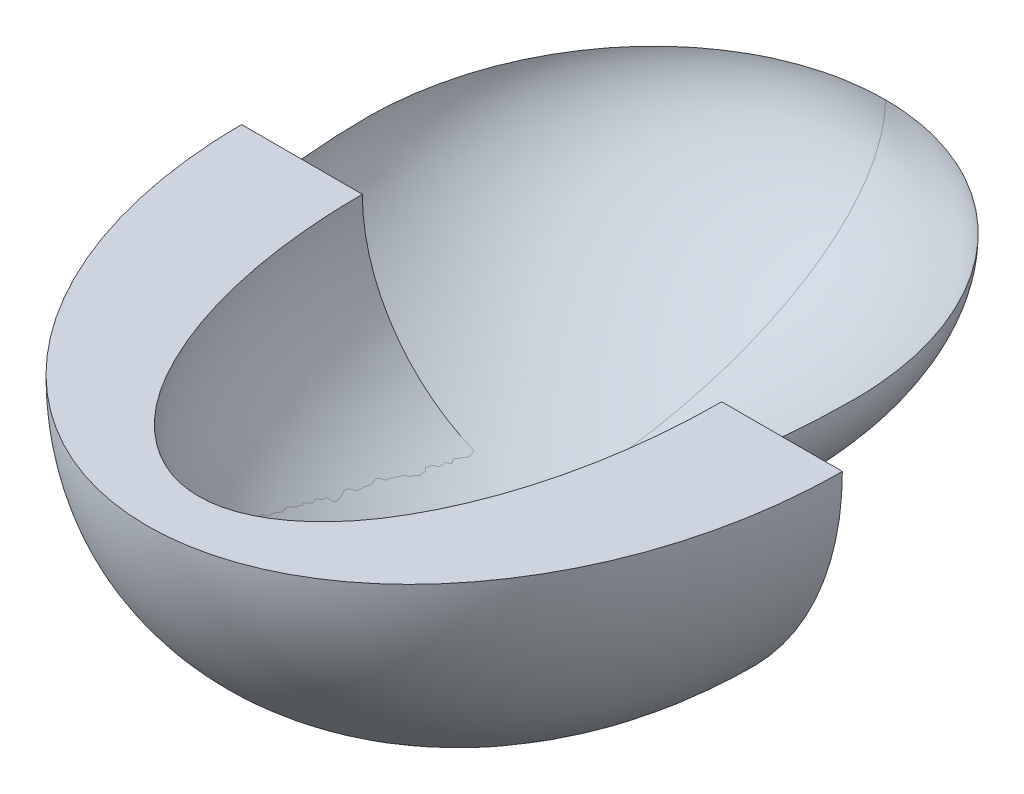
ISO-10303-21;
HEADER;
FILE_DESCRIPTION(('STEP AP214'),'2;1');
FILE_NAME('part.step','',(''),(''),'','','');
FILE_SCHEMA(('AUTOMOTIVE_DESIGN { 1 0 10303 214 1 1 1 1 }'));
ENDSEC;
DATA;
#1=APPLICATION_CONTEXT('core data for automotive mechanical design processes');
#2=APPLICATION_PROTOCOL_DEFINITION('international standard','automotive_design',2000,#1);
#3=PRODUCT_CONTEXT('',#1,'mechanical');
#4=PRODUCT('Part','Part','',(#3));
#5=PRODUCT_RELATED_PRODUCT_CATEGORY('part','',(#4));
#6=PRODUCT_DEFINITION_FORMATION('','',#4);
#7=PRODUCT_DEFINITION_CONTEXT('part definition',#1,'design');
#8=PRODUCT_DEFINITION('design','',#6,#7);
#9=PRODUCT_DEFINITION_SHAPE('','',#8);
#10=(LENGTH_UNIT() NAMED_UNIT(*) SI_UNIT(.MILLI.,.METRE.));
#11=(NAMED_UNIT(*) PLANE_ANGLE_UNIT() SI_UNIT($,.RADIAN.));
#12=(NAMED_UNIT(*) SI_UNIT($,.STERADIAN.) SOLID_ANGLE_UNIT());
#13=UNCERTAINTY_MEASURE_WITH_UNIT(LENGTH_MEASURE(1.E-05),#10,'distance_accuracy_value','');
#14=(GEOMETRIC_REPRESENTATION_CONTEXT(3) GLOBAL_UNCERTAINTY_ASSIGNED_CONTEXT((#13)) GLOBAL_UNIT_ASSIGNED_CONTEXT((#10,
#11,#12)) REPRESENTATION_CONTEXT('',''));
#15=CARTESIAN_POINT('',(0.,0.,0.));
#16=DIRECTION('',(0.,0.,1.));
#17=DIRECTION('',(1.,0.,0.));
#18=AXIS2_PLACEMENT_3D('',#15,#16,#17);
#19=CARTESIAN_POINT('',(70.,2.4241795242083E-13,26.9849999999986));
#20=CARTESIAN_POINT('',(69.9818838517067,2.41036687790433E-13,44.8959764382431));
#21=CARTESIAN_POINT('',(66.8281412208916,2.27717400878021E-13,76.2609987753527));
#22=CARTESIAN_POINT('',(53.4558387601767,1.7802623236085E-13,117.056654385433));
#23=CARTESIAN_POINT('',(33.5668958857723,1.06275165139093E-13,148.437181625429));
#24=CARTESIAN_POINT('',(12.1032915258091,0.,160.829702835873));
#25=CARTESIAN_POINT('',(0.,0.,160.73));
#26=B_SPLINE_CURVE_WITH_KNOTS('',3,(#19,#20,#21,#22,#23,#24,#25),.UNSPECIFIED.,.F.,.F.,(4,1,1,1,
4),(0.,0.329052967648067,0.574264788500087,0.782748668226591,1.),.UNSPECIFIED.);
#27=CARTESIAN_POINT('',(0.,0.,-106.76));
#28=DIRECTION('',(0.,0.,-1.));
#29=AXIS1_PLACEMENT('',#27,#28);
#30=SURFACE_OF_REVOLUTION('',#26,#29);
#31=CARTESIAN_POINT('',(-70.,2.46389435017209E-13,26.9849999999986));
#32=CARTESIAN_POINT('',(-69.9818838517067,2.4764419526021E-13,44.8959764382431));
#33=CARTESIAN_POINT('',(-66.8281412208915,2.38941015086611E-13,76.2609987753527));
#34=CARTESIAN_POINT('',(-53.4558387601767,1.95253894605879E-13,117.056654385433));
#35=CARTESIAN_POINT('',(-33.5668958857723,1.28121216037035E-13,148.437181625429));
#36=CARTESIAN_POINT('',(-12.103291525809,0.,160.829702835873));
#37=CARTESIAN_POINT('',(0.,0.,160.73));
#38=B_SPLINE_CURVE_WITH_KNOTS('',3,(#31,#32,#33,#34,#35,#36,#37),.UNSPECIFIED.,.F.,.F.,(4,1,1,1,
4),(0.,0.329052967648067,0.574264788500087,0.782748668226591,1.),.UNSPECIFIED.);
#39=CARTESIAN_POINT('',(-70.,2.46389435017209E-13,26.9849999999986));
#40=VERTEX_POINT('',#39);
#41=CARTESIAN_POINT('',(0.,0.,160.73));
#42=VERTEX_POINT('',#41);
#43=EDGE_CURVE('E119',#40,#42,#38,.T.);
#44=ORIENTED_EDGE('',*,*,#43,.T.);
#45=CARTESIAN_POINT('',(70.,2.4241795242083E-13,26.9849999999986));
#46=VERTEX_POINT('',#45);
#47=EDGE_CURVE('E124',#46,#42,#26,.T.);
#48=ORIENTED_EDGE('',*,*,#47,.F.);
#49=CARTESIAN_POINT('',(0.,0.,26.9849999999986));
#50=DIRECTION('',(0.,0.,-1.));
#51=DIRECTION('',(-1.,0.,0.));
#52=AXIS2_PLACEMENT_3D('',#49,#50,#51);
#53=CIRCLE('',#52,70.);
#54=EDGE_CURVE('E88',#46,#40,#53,.T.);
#55=ORIENTED_EDGE('',*,*,#54,.T.);
#56=EDGE_LOOP('',(#44,#48,#55));
#57=FACE_BOUND('',#56,.T.);
#58=ADVANCED_FACE('F79',(#57),#30,.T.);
#59=CARTESIAN_POINT('',(0.,0.,26.9849999999986));
#60=DIRECTION('',(0.,1.,0.));
#61=DIRECTION('',(0.,0.,-1.));
#62=AXIS2_PLACEMENT_3D('',#59,#60,#61);
#63=ELLIPSE('',#62,153.745000000001,116.974721302143);
#64=TRIMMED_CURVE('',#63,(PARAMETER_VALUE(3.14159265358979)),
(PARAMETER_VALUE(6.28318530717959)),.T.,.PARAMETER.);
#65=CARTESIAN_POINT('',(0.,0.,-106.76));
#66=DIRECTION('',(0.,0.,-1.));
#67=AXIS1_PLACEMENT('',#65,#66);
#68=SURFACE_OF_REVOLUTION('',#64,#67);
#69=CARTESIAN_POINT('',(0.,0.,26.9849999999986));
#70=DIRECTION('',(0.,0.,-1.));
#71=DIRECTION('',(-1.,0.,0.));
#72=AXIS2_PLACEMENT_3D('',#69,#70,#71);
#73=CIRCLE('',#72,116.974721302143);
#74=CARTESIAN_POINT('',(116.974721302143,4.0642931524462E-13,26.9849999999986));
#75=VERTEX_POINT('',#74);
#76=CARTESIAN_POINT('',(-116.974721302143,4.10400797840999E-13,26.9849999999986));
#77=VERTEX_POINT('',#76);
#78=EDGE_CURVE('E13',#75,#77,#73,.T.);
#79=ORIENTED_EDGE('',*,*,#78,.F.);
#80=CARTESIAN_POINT('',(0.,0.,180.73));
#81=VERTEX_POINT('',#80);
#82=EDGE_CURVE('E117',#81,#75,#63,.T.);
#83=ORIENTED_EDGE('',*,*,#82,.F.);
#84=CARTESIAN_POINT('',(0.,0.,26.9849999999986));
#85=DIRECTION('',(0.,-1.,0.));
#86=DIRECTION('',(0.,0.,-1.));
#87=AXIS2_PLACEMENT_3D('',#84,#85,#86);
#88=ELLIPSE('',#87,153.745000000001,116.974721302143);
#89=EDGE_CURVE('E116',#81,#77,#88,.T.);
#90=ORIENTED_EDGE('',*,*,#89,.T.);
#91=EDGE_LOOP('',(#79,#83,#90));
#92=FACE_BOUND('',#91,.T.);
#93=ADVANCED_FACE('F81',(#92),#68,.T.);
#94=CARTESIAN_POINT('',(116.974721302143,4.0642931524462E-13,26.9849999999986));
#95=DIRECTION('',(0.,0.,1.));
#96=DIRECTION('',(1.,0.,0.));
#97=AXIS2_PLACEMENT_3D('',#94,#95,#96);
#98=PLANE('',#97);
#99=DIRECTION('',(-1.,0.,0.));
#100=VECTOR('',#99,1.);
#101=CARTESIAN_POINT('',(116.974721302143,4.0642931524462E-13,26.9849999999986));
#102=LINE('',#101,#100);
#103=EDGE_CURVE('E115',#75,#46,#102,.T.);
#104=ORIENTED_EDGE('',*,*,#103,.F.);
#105=ORIENTED_EDGE('',*,*,#78,.T.);
#106=DIRECTION('',(1.,0.,0.));
#107=VECTOR('',#106,1.);
#108=CARTESIAN_POINT('',(-116.974721302143,4.10400797840999E-13,26.9849999999986));
#109=LINE('',#108,#107);
#110=EDGE_CURVE('E113',#77,#40,#109,.T.);
#111=ORIENTED_EDGE('',*,*,#110,.T.);
#112=ORIENTED_EDGE('',*,*,#54,.F.);
#113=EDGE_LOOP('',(#104,#105,#111,#112));
#114=FACE_BOUND('',#113,.T.);
#115=ADVANCED_FACE('F111',(#114),#98,.F.);
#116=CARTESIAN_POINT('',(56.0368833226614,1.87769715678806E-13,107.111747955932));
#117=DIRECTION('',(0.,-1.,0.));
#118=DIRECTION('',(0.,0.,1.));
#119=AXIS2_PLACEMENT_3D('',#116,#117,#118);
#120=PLANE('',#119);
#121=ORIENTED_EDGE('',*,*,#47,.T.);
#122=ORIENTED_EDGE('',*,*,#43,.F.);
#123=ORIENTED_EDGE('',*,*,#110,.F.);
#124=ORIENTED_EDGE('',*,*,#89,.F.);
#125=ORIENTED_EDGE('',*,*,#82,.T.);
#126=ORIENTED_EDGE('',*,*,#103,.T.);
#127=EDGE_LOOP('',(#121,#122,#123,#124,#125,#126));
#128=FACE_BOUND('',#127,.T.);
#129=ADVANCED_FACE('F123',(#128),#120,.F.);
#130=CLOSED_SHELL('',(#58,#93,#115,#129));
#131=MANIFOLD_SOLID_BREP('B2',#130);
#132=CARTESIAN_POINT('',(0.,0.,-106.76));
#133=CARTESIAN_POINT('',(0.,0.,-106.76));
#134=CARTESIAN_POINT('',(0.,0.,-106.76));
#135=CARTESIAN_POINT('',(0.,0.,-106.76));
#136=CARTESIAN_POINT('',(3.2231566488897,0.,-106.76));
#137=CARTESIAN_POINT('',(3.2231566488897,-1.27049019910117,-106.76));
#138=CARTESIAN_POINT('',(1.3059825701631,-2.91382910038407,-106.76));
#139=CARTESIAN_POINT('',(0.,-2.91382910038407,-106.76));
#140=CARTESIAN_POINT('',(8.07992711724728,0.,-106.481328661391));
#141=CARTESIAN_POINT('',(8.07992711724728,-3.13928441113222,-106.481328661391));
#142=CARTESIAN_POINT('',(3.24828244422899,-7.25999929974052,-106.231712062474));
#143=CARTESIAN_POINT('',(0.,-7.25999929974052,-106.231712062474));
#144=CARTESIAN_POINT('',(14.5300343221296,0.,-105.551252554512));
#145=CARTESIAN_POINT('',(14.5300343221296,-5.57826588411862,-105.551252554512));
#146=CARTESIAN_POINT('',(5.81322725958236,-12.7862732101335,-104.588624675476));
#147=CARTESIAN_POINT('',(0.,-12.7862732101335,-104.588624675476));
#148=CARTESIAN_POINT('',(19.3374069135839,0.,-104.574145402107));
#149=CARTESIAN_POINT('',(19.3374069135839,-7.3652763946911,-104.574145402107));
#150=CARTESIAN_POINT('',(7.70742247148407,-16.7677945958083,-102.941353482324));
#151=CARTESIAN_POINT('',(0.,-16.7677945958083,-102.941353482324));
#152=CARTESIAN_POINT('',(24.0971572570874,0.,-103.317195266243));
#153=CARTESIAN_POINT('',(24.0971572570874,-9.09420778845644,-103.317195266243));
#154=CARTESIAN_POINT('',(9.56561009362985,-20.5572577316179,-100.933522718515));
#155=CARTESIAN_POINT('',(0.,-20.5572577316179,-100.933522718515));
#156=CARTESIAN_POINT('',(28.7933131510599,0.,-101.78696570987));
#157=CARTESIAN_POINT('',(28.7933131510599,-10.762475681816,-101.78696570987));
#158=CARTESIAN_POINT('',(11.3817025746843,-24.1499280437647,-98.6153371010839));
#159=CARTESIAN_POINT('',(0.,-24.1499280437647,-98.6153371010839));
#160=CARTESIAN_POINT('',(33.4099023939212,0.,-99.9900202959344));
#161=CARTESIAN_POINT('',(33.4099023939212,-12.3674956911713,-99.9900202959344));
#162=CARTESIAN_POINT('',(13.1501553332077,-27.5410709584509,-96.0370013470672));
#163=CARTESIAN_POINT('',(0.,-27.5410709584509,-96.0370013470672));
#164=CARTESIAN_POINT('',(37.930952784091,0.,-97.9329225873861));
#165=CARTESIAN_POINT('',(37.930952784091,-13.9075418877717,-97.9329225873861));
#166=CARTESIAN_POINT('',(14.8666856724175,-30.7371723172724,-93.2363870041482));
#167=CARTESIAN_POINT('',(0.,-30.7371723172724,-93.2363870041483));
#168=CARTESIAN_POINT('',(42.3404921199892,0.,-95.6222361471735));
#169=CARTESIAN_POINT('',(42.3404921199892,-15.3808883428669,-95.6222361471735));
#170=CARTESIAN_POINT('',(16.526950557035,-33.744717961825,-90.2513656200106));
#171=CARTESIAN_POINT('',(0.,-33.744717961825,-90.2513656200106));
#172=CARTESIAN_POINT('',(46.6266021791986,0.,-93.0690086550165));
#173=CARTESIAN_POINT('',(46.6266021791986,-16.7880694272741,-93.0690086550165));
#174=CARTESIAN_POINT('',(18.1284646474157,-36.5736959027753,-87.1077072951965));
#175=CARTESIAN_POINT('',(0.,-36.5736959027753,-87.1077072951965));
#176=CARTESIAN_POINT('',(50.7773647393022,0.,-90.2842877906353));
#177=CARTESIAN_POINT('',(50.7773647393022,-18.1296195118107,-90.2842877906353));
#178=CARTESIAN_POINT('',(19.6687323973919,-39.23409415079,-83.8311821302486));
#179=CARTESIAN_POINT('',(0.,-39.23409415079,-83.8311821302486));
#180=CARTESIAN_POINT('',(56.1153605240764,0.,-86.2773990481215));
#181=CARTESIAN_POINT('',(56.1153605240764,-19.8315345374067,-86.2773990481215));
#182=CARTESIAN_POINT('',(21.6376223979768,-42.569653668336,-79.3085509508303));
#183=CARTESIAN_POINT('',(0.,-42.569653668336,-79.3085509508303));
#184=CARTESIAN_POINT('',(62.389895395194,0.,-80.7452930880191));
#185=CARTESIAN_POINT('',(62.389895395194,-21.7974367423803,-80.7452930880191));
#186=CARTESIAN_POINT('',(23.9338416748224,-46.3669092483319,-73.410187978813));
#187=CARTESIAN_POINT('',(0.,-46.3669092483319,-73.410187978813));
#188=CARTESIAN_POINT('',(69.2229546299265,0.,-73.3728148666212));
#189=CARTESIAN_POINT('',(69.2229546299265,-23.9067992287153,-73.3728148666212));
#190=CARTESIAN_POINT('',(26.4170104240179,-50.3962349303918,-66.03211301506));
#191=CARTESIAN_POINT('',(0.,-50.3962349303918,-66.03211301506));
#192=CARTESIAN_POINT('',(75.2999844192022,0.,-65.3700265578099));
#193=CARTESIAN_POINT('',(75.2999844192022,-25.7727245506407,-65.3700265578099));
#194=CARTESIAN_POINT('',(28.6186793368892,-53.955815614944,-58.4179244456776));
#195=CARTESIAN_POINT('',(0.,-53.955815614944,-58.4179244456776));
#196=CARTESIAN_POINT('',(80.5916745004031,0.,-56.8401231338059));
#197=CARTESIAN_POINT('',(80.5916745004031,-27.4035630984844,-56.8401231338059));
#198=CARTESIAN_POINT('',(30.5369183696167,-57.089677331254,-50.6081221354979));
#199=CARTESIAN_POINT('',(0.,-57.089677331254,-50.6081221354979));
#200=CARTESIAN_POINT('',(85.0687146109113,0.,-47.8862995668304));
#201=CARTESIAN_POINT('',(85.0687146109113,-28.804694807475,-47.8862995668304));
#202=CARTESIAN_POINT('',(32.1698416073613,-59.8369520617869,-42.6346234105809));
#203=CARTESIAN_POINT('',(0.,-59.8369520617869,-42.6346234105809));
#204=CARTESIAN_POINT('',(89.9419248304847,0.,-35.5098126828188));
#205=CARTESIAN_POINT('',(89.9419248304847,-30.3774647529425,-35.5098126828188));
#206=CARTESIAN_POINT('',(33.9660945037632,-63.0181217950914,-31.8059484423562));
#207=CARTESIAN_POINT('',(0.,-63.0181217950914,-31.8059484423562));
#208=CARTESIAN_POINT('',(93.9594003025421,0.,-19.4562964550676));
#209=CARTESIAN_POINT('',(93.9594003025421,-31.8099230324609,-19.4562964550676));
#210=CARTESIAN_POINT('',(35.5236380880842,-66.1540642733927,-17.9393082626607));
#211=CARTESIAN_POINT('',(0.,-66.1540642733927,-17.9393082626607));
#212=CARTESIAN_POINT('',(95.,0.,-6.44524771776624));
#213=CARTESIAN_POINT('',(95.,-32.376222495375,-6.44524771776624));
#214=CARTESIAN_POINT('',(35.9847391372484,-67.838829955684,-6.51889540212107));
#215=CARTESIAN_POINT('',(0.,-67.838829955684,-6.51889540212107));
#216=CARTESIAN_POINT('',(95.,0.,8.67015313439256));
#217=CARTESIAN_POINT('',(95.,-32.7910407917112,8.67015313439256));
#218=CARTESIAN_POINT('',(36.229255283427,-69.3442729450164,7.06122860846818));
#219=CARTESIAN_POINT('',(0.,-69.3442729450164,7.06122860846818));
#220=CARTESIAN_POINT('',(94.1745658421474,0.,25.8822907318209));
#221=CARTESIAN_POINT('',(94.1745658421474,-32.8823127228026,25.8822907318209));
#222=CARTESIAN_POINT('',(36.0527094183753,-70.3342874928922,22.8284043911539));
#223=CARTESIAN_POINT('',(0.,-70.3342874928922,22.8284043911539));
#224=CARTESIAN_POINT('',(91.1105804206838,0.,46.9768367836032));
#225=CARTESIAN_POINT('',(91.1105804206838,-32.2607665577332,46.9768367836032));
#226=CARTESIAN_POINT('',(35.1119473459241,-69.7344560824126,42.7854707369183));
#227=CARTESIAN_POINT('',(0.,-69.7344560824126,42.7854707369183));
#228=CARTESIAN_POINT('',(87.3883387182954,0.,63.5148512987044));
#229=CARTESIAN_POINT('',(87.3883387182954,-31.2575695468249,63.5148512987044));
#230=CARTESIAN_POINT('',(33.8293410076888,-68.09859655662,58.751528376765));
#231=CARTESIAN_POINT('',(0.,-68.09859655662,58.751528376765));
#232=CARTESIAN_POINT('',(83.9286638198187,0.,75.7134828322865));
#233=CARTESIAN_POINT('',(83.9286638198187,-30.2463956613129,75.7134828322865));
#234=CARTESIAN_POINT('',(32.6013140349574,-66.2671662097002,70.68274406886));
#235=CARTESIAN_POINT('',(0.,-66.2671662097002,70.68274406886));
#236=CARTESIAN_POINT('',(79.7685283605801,0.,87.6711668235439));
#237=CARTESIAN_POINT('',(79.7685283605801,-28.9610693035737,87.6711668235439));
#238=CARTESIAN_POINT('',(31.0903012797101,-63.7991839758935,82.5226919325189));
#239=CARTESIAN_POINT('',(0.,-63.7991839758935,82.5226919325189));
#240=CARTESIAN_POINT('',(74.8535615699544,0.,99.3273910855378));
#241=CARTESIAN_POINT('',(74.8535615699544,-27.3814772324514,99.3273910855378));
#242=CARTESIAN_POINT('',(29.2754281102818,-60.6489580486664,94.2123275011584));
#243=CARTESIAN_POINT('',(0.,-60.6489580486664,94.2123275011584));
#244=CARTESIAN_POINT('',(69.1229622652596,0.,110.607621535298));
#245=CARTESIAN_POINT('',(69.1229622652596,-25.4826284608043,110.607621535298));
#246=CARTESIAN_POINT('',(27.131312589633,-56.7578236129468,105.678115299105));
#247=CARTESIAN_POINT('',(0.,-56.7578236129468,105.678115299105));
#248=CARTESIAN_POINT('',(63.6010036254168,0.,119.602698974999));
#249=CARTESIAN_POINT('',(63.6010036254168,-23.6065913194018,119.602698974999));
#250=CARTESIAN_POINT('',(25.0424494371623,-52.8320686961535,114.965017286541));
#251=CARTESIAN_POINT('',(0.,-52.8320686961535,114.965017286541));
#252=CARTESIAN_POINT('',(58.6894784776992,0.,126.478577917121));
#253=CARTESIAN_POINT('',(58.6894784776992,-21.9090202063988,126.478577917121));
#254=CARTESIAN_POINT('',(23.1702053036467,-49.2305900684661,122.165538717903));
#255=CARTESIAN_POINT('',(0.,-49.2305900684661,122.165538717903));
#256=CARTESIAN_POINT('',(54.7460969892179,0.,131.447542343309));
#257=CARTESIAN_POINT('',(54.7460969892179,-20.5310686356624,131.447542343309));
#258=CARTESIAN_POINT('',(21.6595904975151,-46.2821830743294,127.4262544867));
#259=CARTESIAN_POINT('',(0.,-46.2821830743294,127.4262544867));
#260=CARTESIAN_POINT('',(50.5302193632719,0.,136.200708713508));
#261=CARTESIAN_POINT('',(50.5302193632719,-19.041939961548,136.200708713508));
#262=CARTESIAN_POINT('',(20.0366868904202,-43.0696173805767,132.52211972534));
#263=CARTESIAN_POINT('',(0.,-43.0696173805767,132.52211972534));
#264=CARTESIAN_POINT('',(46.03030176155,0.,140.697961455693));
#265=CARTESIAN_POINT('',(46.03030176155,-17.4345488813355,140.697961455693));
#266=CARTESIAN_POINT('',(18.2955689745004,-39.5726510784224,137.41375523949));
#267=CARTESIAN_POINT('',(0.,-39.5726510784224,137.41375523949));
#268=CARTESIAN_POINT('',(41.2348003457411,0.,144.899184997838));
#269=CARTESIAN_POINT('',(41.2348003457411,-15.7018102879936,144.899184997838));
#270=CARTESIAN_POINT('',(16.4303113600441,-35.7710422590809,142.061781834817));
#271=CARTESIAN_POINT('',(0.,-35.7710422590809,142.061781834817));
#272=CARTESIAN_POINT('',(36.139146278959,0.,148.748860505028));
#273=CARTESIAN_POINT('',(36.139146278959,-13.8373714993918,148.748860505028));
#274=CARTESIAN_POINT('',(14.4368578566069,-31.642998769363,146.402682235553));
#275=CARTESIAN_POINT('',(0.,-31.642998769363,146.402682235553));
#276=CARTESIAN_POINT('',(31.6388333167577,0.,151.617701036127));
#277=CARTESIAN_POINT('',(31.6388333167577,-12.1686151872818,151.617701036127));
#278=CARTESIAN_POINT('',(12.6654230953121,-27.9127735082932,149.711229677533));
#279=CARTESIAN_POINT('',(0.,-27.9127735082932,149.711229677533));
#280=CARTESIAN_POINT('',(27.8929909746491,0.,153.673747566483));
#281=CARTESIAN_POINT('',(27.8929909746491,-10.7650418802396,153.673747566483));
#282=CARTESIAN_POINT('',(11.1838535635937,-24.7519042124176,152.122271262424));
#283=CARTESIAN_POINT('',(0.,-24.7519042124176,152.122271262424));
#284=CARTESIAN_POINT('',(25.0125054247894,0.,155.08739640209));
#285=CARTESIAN_POINT('',(25.0125054247894,-9.67818467245045,155.08739640209));
#286=CARTESIAN_POINT('',(10.040884087039,-22.2922637781919,153.800035608366));
#287=CARTESIAN_POINT('',(0.,-22.2922637781919,153.800035608366));
#288=CARTESIAN_POINT('',(22.0626082745469,0.,156.36378606064));
#289=CARTESIAN_POINT('',(22.0626082745469,-8.5572571383234,156.36378606064));
#290=CARTESIAN_POINT('',(8.86653721799254,-19.742990962838,155.334664453205));
#291=CARTESIAN_POINT('',(0.,-19.742990962838,155.334664453205));
#292=CARTESIAN_POINT('',(19.0491334057011,0.,157.494237393513));
#293=CARTESIAN_POINT('',(19.0491334057011,-7.40448350938601,157.494237393513));
#294=CARTESIAN_POINT('',(7.66316363147706,-17.1090371838527,156.709534321109));
#295=CARTESIAN_POINT('',(0.,-17.1090371838527,156.709534321109));
#296=CARTESIAN_POINT('',(15.9779147000313,0.,158.470071252086));
#297=CARTESIAN_POINT('',(15.9779147000313,-6.22208801716582,158.470071252086));
#298=CARTESIAN_POINT('',(6.43309585451929,-14.3953538587329,157.908021736248));
#299=CARTESIAN_POINT('',(0.,-14.3953538587329,157.908021736248));
#300=CARTESIAN_POINT('',(11.8137431524121,0.,159.553454232956));
#301=CARTESIAN_POINT('',(11.8137431524121,-4.610222271768,159.553454232956));
#302=CARTESIAN_POINT('',(4.76111074804149,-10.6820820826553,159.250925194884));
#303=CARTESIAN_POINT('',(0.,-10.6820820826553,159.250925194884));
#304=CARTESIAN_POINT('',(7.55741945826233,0.,160.292885670744));
#305=CARTESIAN_POINT('',(7.55741945826233,-2.95158498562305,160.292885670744));
#306=CARTESIAN_POINT('',(3.04681469438284,-6.84318737109296,160.181354274402));
#307=CARTESIAN_POINT('',(0.,-6.84318737109296,160.181354274402));
#308=CARTESIAN_POINT('',(3.78741227580382,0.,160.620179606072));
#309=CARTESIAN_POINT('',(3.78741227580382,-1.47876067557135,160.620179606072));
#310=CARTESIAN_POINT('',(1.52668264969611,-3.42800996049718,160.592285872112));
#311=CARTESIAN_POINT('',(0.,-3.42800996049718,160.592285872112));
#312=CARTESIAN_POINT('',(1.89526876488072,0.,160.702477175066));
#313=CARTESIAN_POINT('',(1.89526876488072,-0.739728460601254,160.702477175066));
#314=CARTESIAN_POINT('',(0.763834477923917,-1.71445605795106,160.695502380967));
#315=CARTESIAN_POINT('',(0.,-1.71445605795106,160.695502380967));
#316=CARTESIAN_POINT('',(0.812616934130052,0.,160.726058492659));
#317=CARTESIAN_POINT('',(0.812616934130052,-0.317068353245627,160.726058492659));
#318=CARTESIAN_POINT('',(0.327457252506282,-0.734731048317559,160.725061899129));
#319=CARTESIAN_POINT('',(0.,-0.734731048317559,160.725061899129));
#320=CARTESIAN_POINT('',(0.270917531247602,0.,160.73));
#321=CARTESIAN_POINT('',(0.270917531247602,-0.105689451081878,160.73));
#322=CARTESIAN_POINT('',(0.109152417502096,-0.244876924994769,160.73));
#323=CARTESIAN_POINT('',(0.,-0.244876924994769,160.73));
#324=CARTESIAN_POINT('',(0.,0.,160.73));
#325=CARTESIAN_POINT('',(0.,0.,160.73));
#326=CARTESIAN_POINT('',(0.,0.,160.73));
#327=CARTESIAN_POINT('',(0.,0.,160.73));
#328=B_SPLINE_SURFACE_WITH_KNOTS('',3,3,((#132,#133,#134,#135),(#136,#137,#138,#139),(#140,#141,
#142,#143),(#144,#145,#146,#147),(#148,#149,#150,#151),(#152,#153,#154,#155),(#156,#157,#158,
#159),(#160,#161,#162,#163),(#164,#165,#166,#167),(#168,#169,#170,#171),(#172,#173,#174,#175),
(#176,#177,#178,#179),(#180,#181,#182,#183),(#184,#185,#186,#187),(#188,#189,#190,#191),(#192,
#193,#194,#195),(#196,#197,#198,#199),(#200,#201,#202,#203),(#204,#205,#206,#207),(#208,#209,
#210,#211),(#212,#213,#214,#215),(#216,#217,#218,#219),(#220,#221,#222,#223),(#224,#225,#226,
#227),(#228,#229,#230,#231),(#232,#233,#234,#235),(#236,#237,#238,#239),(#240,#241,#242,#243),
(#244,#245,#246,#247),(#248,#249,#250,#251),(#252,#253,#254,#255),(#256,#257,#258,#259),(#260,
#261,#262,#263),(#264,#265,#266,#267),(#268,#269,#270,#271),(#272,#273,#274,#275),(#276,#277,
#278,#279),(#280,#281,#282,#283),(#284,#285,#286,#287),(#288,#289,#290,#291),(#292,#293,#294,
#295),(#296,#297,#298,#299),(#300,#301,#302,#303),(#304,#305,#306,#307),(#308,#309,#310,#311),
(#312,#313,#314,#315),(#316,#317,#318,#319),(#320,#321,#322,#323),(#324,#325,#326,#327)),
.UNSPECIFIED.,.F.,.F.,.F.,(4,1,1,1,1,1,1,1,1,1,1,1,1,1,1,1,1,1,1,2,1,1,1,1,1,1,1,1,1,1,1,1,1,1,
1,1,1,1,1,1,1,1,1,1,1,4),(4,4),(0.,0.0266501686789773,0.0399752530184659,0.0533003373579545,
0.0666254216974432,0.0799505060369318,0.0932755903764204,0.106600674715909,0.119925759055398,
0.133250843394886,0.146575927734375,0.159901012073864,0.186551180752841,0.213201349431818,
0.239851518110795,0.266501686789773,0.29315185546875,0.319802024147727,0.373102361505682,
0.426402698863636,0.498102361505682,0.569802024147727,0.60565185546875,0.641501686789773,
0.677351518110795,0.713201349431818,0.749051180752841,0.784901012073864,0.802825927734375,
0.820750843394886,0.838675759055398,0.856600674715909,0.87452559037642,0.892450506036932,
0.910375421697443,0.919337879527699,0.928300337357954,0.93726279518821,0.946225253018466,
0.955187710848722,0.964150168678977,0.982075084339489,0.991037542169744,0.995518771084872,
0.997759385542436,1.),(0.,1.),.UNSPECIFIED.);
#329=CARTESIAN_POINT('',(0.,0.,0.));
#330=DIRECTION('',(0.,-1.,0.));
#331=DIRECTION('',(0.,0.,-1.));
#332=AXIS2_PLACEMENT_3D('',#329,#330,#331);
#333=ELLIPSE('',#332,106.76,95.);
#334=CARTESIAN_POINT('',(0.,0.,-106.76));
#335=VERTEX_POINT('',#334);
#336=CARTESIAN_POINT('',(95.,0.,-6.38126866395278E-12));
#337=VERTEX_POINT('',#336);
#338=EDGE_CURVE('E77',#335,#337,#333,.T.);
#339=CARTESIAN_POINT('',(0.,0.,26.985));
#340=DIRECTION('',(1.,0.,0.));
#341=DIRECTION('',(0.,0.,-1.));
#342=AXIS2_PLACEMENT_3D('',#339,#340,#341);
#343=ELLIPSE('',#342,133.745,70.);
#344=CARTESIAN_POINT('',(0.,0.,160.73));
#345=VERTEX_POINT('',#344);
#346=EDGE_CURVE('E190',#335,#345,#343,.F.);
#347=CARTESIAN_POINT('',(0.,0.,0.));
#348=DIRECTION('',(0.,1.,0.));
#349=DIRECTION('',(0.,0.,1.));
#350=AXIS2_PLACEMENT_3D('',#347,#348,#349);
#351=ELLIPSE('',#350,160.73,95.);
#352=EDGE_CURVE('E196',#337,#345,#351,.F.);
#353=ORIENTED_EDGE('',*,*,#338,.F.);
#354=ORIENTED_EDGE('',*,*,#346,.T.);
#355=ORIENTED_EDGE('',*,*,#352,.F.);
#356=EDGE_LOOP('',(#353,#354,#355));
#357=FACE_BOUND('',#356,.T.);
#358=ADVANCED_FACE('F186',(#357),#328,.F.);
#359=OPEN_SHELL('',(#358));
#360=SHELL_BASED_SURFACE_MODEL('B7',(#359));
#361=CARTESIAN_POINT('',(0.,0.,-106.76));
#362=CARTESIAN_POINT('',(0.,0.,-106.76));
#363=CARTESIAN_POINT('',(0.,0.,-106.76));
#364=CARTESIAN_POINT('',(0.,0.,-106.76));
#365=CARTESIAN_POINT('',(-3.2231566488897,0.,-106.76));
#366=CARTESIAN_POINT('',(-3.2231566488897,-1.27049019910117,-106.76));
#367=CARTESIAN_POINT('',(-1.3059825701631,-2.91382910038407,-106.76));
#368=CARTESIAN_POINT('',(0.,-2.91382910038407,-106.76));
#369=CARTESIAN_POINT('',(-8.07992711724728,0.,-106.481328661391));
#370=CARTESIAN_POINT('',(-8.07992711724728,-3.13928441113222,-106.481328661391));
#371=CARTESIAN_POINT('',(-3.24828244422899,-7.25999929974052,-106.231712062474));
#372=CARTESIAN_POINT('',(0.,-7.25999929974052,-106.231712062474));
#373=CARTESIAN_POINT('',(-14.5300343221296,0.,-105.551252554512));
#374=CARTESIAN_POINT('',(-14.5300343221296,-5.57826588411862,-105.551252554512));
#375=CARTESIAN_POINT('',(-5.81322725958236,-12.7862732101335,-104.588624675476));
#376=CARTESIAN_POINT('',(0.,-12.7862732101335,-104.588624675476));
#377=CARTESIAN_POINT('',(-19.3374069135839,0.,-104.574145402107));
#378=CARTESIAN_POINT('',(-19.3374069135839,-7.3652763946911,-104.574145402107));
#379=CARTESIAN_POINT('',(-7.70742247148407,-16.7677945958083,-102.941353482324));
#380=CARTESIAN_POINT('',(0.,-16.7677945958083,-102.941353482324));
#381=CARTESIAN_POINT('',(-24.0971572570874,0.,-103.317195266243));
#382=CARTESIAN_POINT('',(-24.0971572570874,-9.09420778845644,-103.317195266243));
#383=CARTESIAN_POINT('',(-9.56561009362985,-20.5572577316179,-100.933522718515));
#384=CARTESIAN_POINT('',(0.,-20.5572577316179,-100.933522718515));
#385=CARTESIAN_POINT('',(-28.7933131510599,0.,-101.78696570987));
#386=CARTESIAN_POINT('',(-28.7933131510599,-10.762475681816,-101.78696570987));
#387=CARTESIAN_POINT('',(-11.3817025746843,-24.1499280437647,-98.6153371010839));
#388=CARTESIAN_POINT('',(0.,-24.1499280437647,-98.6153371010839));
#389=CARTESIAN_POINT('',(-33.4099023939212,0.,-99.9900202959344));
#390=CARTESIAN_POINT('',(-33.4099023939212,-12.3674956911713,-99.9900202959344));
#391=CARTESIAN_POINT('',(-13.1501553332077,-27.5410709584509,-96.0370013470672));
#392=CARTESIAN_POINT('',(0.,-27.5410709584509,-96.0370013470672));
#393=CARTESIAN_POINT('',(-37.930952784091,0.,-97.9329225873861));
#394=CARTESIAN_POINT('',(-37.930952784091,-13.9075418877717,-97.9329225873861));
#395=CARTESIAN_POINT('',(-14.8666856724175,-30.7371723172724,-93.2363870041482));
#396=CARTESIAN_POINT('',(0.,-30.7371723172724,-93.2363870041483));
#397=CARTESIAN_POINT('',(-42.3404921199892,0.,-95.6222361471735));
#398=CARTESIAN_POINT('',(-42.3404921199892,-15.3808883428669,-95.6222361471735));
#399=CARTESIAN_POINT('',(-16.526950557035,-33.744717961825,-90.2513656200106));
#400=CARTESIAN_POINT('',(0.,-33.744717961825,-90.2513656200106));
#401=CARTESIAN_POINT('',(-46.6266021791986,0.,-93.0690086550165));
#402=CARTESIAN_POINT('',(-46.6266021791986,-16.7880694272741,-93.0690086550165));
#403=CARTESIAN_POINT('',(-18.1284646474157,-36.5736959027753,-87.1077072951965));
#404=CARTESIAN_POINT('',(0.,-36.5736959027753,-87.1077072951965));
#405=CARTESIAN_POINT('',(-50.7773647393022,0.,-90.2842877906353));
#406=CARTESIAN_POINT('',(-50.7773647393022,-18.1296195118107,-90.2842877906353));
#407=CARTESIAN_POINT('',(-19.6687323973919,-39.23409415079,-83.8311821302486));
#408=CARTESIAN_POINT('',(0.,-39.23409415079,-83.8311821302486));
#409=CARTESIAN_POINT('',(-56.1153605240764,0.,-86.2773990481215));
#410=CARTESIAN_POINT('',(-56.1153605240764,-19.8315345374067,-86.2773990481215));
#411=CARTESIAN_POINT('',(-21.6376223979768,-42.569653668336,-79.3085509508303));
#412=CARTESIAN_POINT('',(0.,-42.569653668336,-79.3085509508303));
#413=CARTESIAN_POINT('',(-62.389895395194,0.,-80.7452930880191));
#414=CARTESIAN_POINT('',(-62.389895395194,-21.7974367423803,-80.7452930880191));
#415=CARTESIAN_POINT('',(-23.9338416748224,-46.3669092483319,-73.410187978813));
#416=CARTESIAN_POINT('',(0.,-46.3669092483319,-73.410187978813));
#417=CARTESIAN_POINT('',(-69.2229546299265,0.,-73.3728148666212));
#418=CARTESIAN_POINT('',(-69.2229546299265,-23.9067992287153,-73.3728148666212));
#419=CARTESIAN_POINT('',(-26.4170104240179,-50.3962349303918,-66.03211301506));
#420=CARTESIAN_POINT('',(0.,-50.3962349303918,-66.03211301506));
#421=CARTESIAN_POINT('',(-75.2999844192022,0.,-65.3700265578099));
#422=CARTESIAN_POINT('',(-75.2999844192022,-25.7727245506407,-65.3700265578099));
#423=CARTESIAN_POINT('',(-28.6186793368892,-53.955815614944,-58.4179244456776));
#424=CARTESIAN_POINT('',(0.,-53.955815614944,-58.4179244456776));
#425=CARTESIAN_POINT('',(-80.5916745004031,0.,-56.8401231338059));
#426=CARTESIAN_POINT('',(-80.5916745004031,-27.4035630984844,-56.8401231338059));
#427=CARTESIAN_POINT('',(-30.5369183696167,-57.089677331254,-50.6081221354979));
#428=CARTESIAN_POINT('',(0.,-57.089677331254,-50.6081221354979));
#429=CARTESIAN_POINT('',(-85.0687146109113,0.,-47.8862995668304));
#430=CARTESIAN_POINT('',(-85.0687146109113,-28.804694807475,-47.8862995668304));
#431=CARTESIAN_POINT('',(-32.1698416073613,-59.8369520617869,-42.6346234105809));
#432=CARTESIAN_POINT('',(0.,-59.8369520617869,-42.6346234105809));
#433=CARTESIAN_POINT('',(-89.9419248304847,0.,-35.5098126828188));
#434=CARTESIAN_POINT('',(-89.9419248304847,-30.3774647529425,-35.5098126828188));
#435=CARTESIAN_POINT('',(-33.9660945037632,-63.0181217950914,-31.8059484423562));
#436=CARTESIAN_POINT('',(0.,-63.0181217950914,-31.8059484423562));
#437=CARTESIAN_POINT('',(-93.9594003025421,0.,-19.4562964550676));
#438=CARTESIAN_POINT('',(-93.9594003025421,-31.8099230324609,-19.4562964550676));
#439=CARTESIAN_POINT('',(-35.5236380880842,-66.1540642733927,-17.9393082626607));
#440=CARTESIAN_POINT('',(0.,-66.1540642733927,-17.9393082626607));
#441=CARTESIAN_POINT('',(-95.,0.,-6.44524771776624));
#442=CARTESIAN_POINT('',(-95.,-32.376222495375,-6.44524771776624));
#443=CARTESIAN_POINT('',(-35.9847391372484,-67.838829955684,-6.51889540212107));
#444=CARTESIAN_POINT('',(0.,-67.838829955684,-6.51889540212107));
#445=CARTESIAN_POINT('',(-95.,0.,8.67015313439256));
#446=CARTESIAN_POINT('',(-95.,-32.7910407917112,8.67015313439256));
#447=CARTESIAN_POINT('',(-36.229255283427,-69.3442729450164,7.06122860846818));
#448=CARTESIAN_POINT('',(0.,-69.3442729450164,7.06122860846818));
#449=CARTESIAN_POINT('',(-94.1745658421474,0.,25.8822907318209));
#450=CARTESIAN_POINT('',(-94.1745658421474,-32.8823127228026,25.8822907318209));
#451=CARTESIAN_POINT('',(-36.0527094183753,-70.3342874928922,22.8284043911539));
#452=CARTESIAN_POINT('',(0.,-70.3342874928922,22.8284043911539));
#453=CARTESIAN_POINT('',(-91.1105804206838,0.,46.9768367836032));
#454=CARTESIAN_POINT('',(-91.1105804206838,-32.2607665577332,46.9768367836032));
#455=CARTESIAN_POINT('',(-35.1119473459241,-69.7344560824126,42.7854707369183));
#456=CARTESIAN_POINT('',(0.,-69.7344560824126,42.7854707369183));
#457=CARTESIAN_POINT('',(-87.3883387182954,0.,63.5148512987044));
#458=CARTESIAN_POINT('',(-87.3883387182954,-31.2575695468249,63.5148512987044));
#459=CARTESIAN_POINT('',(-33.8293410076888,-68.09859655662,58.751528376765));
#460=CARTESIAN_POINT('',(0.,-68.09859655662,58.751528376765));
#461=CARTESIAN_POINT('',(-83.9286638198187,0.,75.7134828322865));
#462=CARTESIAN_POINT('',(-83.9286638198187,-30.2463956613129,75.7134828322865));
#463=CARTESIAN_POINT('',(-32.6013140349574,-66.2671662097002,70.68274406886));
#464=CARTESIAN_POINT('',(0.,-66.2671662097002,70.68274406886));
#465=CARTESIAN_POINT('',(-79.7685283605801,0.,87.6711668235439));
#466=CARTESIAN_POINT('',(-79.7685283605801,-28.9610693035737,87.6711668235439));
#467=CARTESIAN_POINT('',(-31.0903012797101,-63.7991839758935,82.5226919325189));
#468=CARTESIAN_POINT('',(0.,-63.7991839758935,82.5226919325189));
#469=CARTESIAN_POINT('',(-74.8535615699544,0.,99.3273910855378));
#470=CARTESIAN_POINT('',(-74.8535615699544,-27.3814772324514,99.3273910855378));
#471=CARTESIAN_POINT('',(-29.2754281102818,-60.6489580486664,94.2123275011584));
#472=CARTESIAN_POINT('',(0.,-60.6489580486664,94.2123275011584));
#473=CARTESIAN_POINT('',(-69.1229622652596,0.,110.607621535298));
#474=CARTESIAN_POINT('',(-69.1229622652596,-25.4826284608043,110.607621535298));
#475=CARTESIAN_POINT('',(-27.131312589633,-56.7578236129468,105.678115299105));
#476=CARTESIAN_POINT('',(0.,-56.7578236129468,105.678115299105));
#477=CARTESIAN_POINT('',(-63.6010036254168,0.,119.602698974999));
#478=CARTESIAN_POINT('',(-63.6010036254168,-23.6065913194018,119.602698974999));
#479=CARTESIAN_POINT('',(-25.0424494371623,-52.8320686961535,114.965017286541));
#480=CARTESIAN_POINT('',(0.,-52.8320686961535,114.965017286541));
#481=CARTESIAN_POINT('',(-58.6894784776992,0.,126.478577917121));
#482=CARTESIAN_POINT('',(-58.6894784776992,-21.9090202063988,126.478577917121));
#483=CARTESIAN_POINT('',(-23.1702053036467,-49.2305900684661,122.165538717903));
#484=CARTESIAN_POINT('',(0.,-49.2305900684661,122.165538717903));
#485=CARTESIAN_POINT('',(-54.7460969892179,0.,131.447542343309));
#486=CARTESIAN_POINT('',(-54.7460969892179,-20.5310686356624,131.447542343309));
#487=CARTESIAN_POINT('',(-21.6595904975151,-46.2821830743294,127.4262544867));
#488=CARTESIAN_POINT('',(0.,-46.2821830743294,127.4262544867));
#489=CARTESIAN_POINT('',(-50.5302193632719,0.,136.200708713508));
#490=CARTESIAN_POINT('',(-50.5302193632719,-19.041939961548,136.200708713508));
#491=CARTESIAN_POINT('',(-20.0366868904202,-43.0696173805767,132.52211972534));
#492=CARTESIAN_POINT('',(0.,-43.0696173805767,132.52211972534));
#493=CARTESIAN_POINT('',(-46.03030176155,0.,140.697961455693));
#494=CARTESIAN_POINT('',(-46.03030176155,-17.4345488813355,140.697961455693));
#495=CARTESIAN_POINT('',(-18.2955689745004,-39.5726510784224,137.41375523949));
#496=CARTESIAN_POINT('',(0.,-39.5726510784224,137.41375523949));
#497=CARTESIAN_POINT('',(-41.2348003457411,0.,144.899184997838));
#498=CARTESIAN_POINT('',(-41.2348003457411,-15.7018102879936,144.899184997838));
#499=CARTESIAN_POINT('',(-16.4303113600441,-35.7710422590809,142.061781834817));
#500=CARTESIAN_POINT('',(0.,-35.7710422590809,142.061781834817));
#501=CARTESIAN_POINT('',(-36.139146278959,0.,148.748860505028));
#502=CARTESIAN_POINT('',(-36.139146278959,-13.8373714993918,148.748860505028));
#503=CARTESIAN_POINT('',(-14.4368578566069,-31.642998769363,146.402682235553));
#504=CARTESIAN_POINT('',(0.,-31.642998769363,146.402682235553));
#505=CARTESIAN_POINT('',(-31.6388333167577,0.,151.617701036127));
#506=CARTESIAN_POINT('',(-31.6388333167577,-12.1686151872818,151.617701036127));
#507=CARTESIAN_POINT('',(-12.6654230953121,-27.9127735082932,149.711229677533));
#508=CARTESIAN_POINT('',(0.,-27.9127735082932,149.711229677533));
#509=CARTESIAN_POINT('',(-27.8929909746491,0.,153.673747566483));
#510=CARTESIAN_POINT('',(-27.8929909746491,-10.7650418802396,153.673747566483));
#511=CARTESIAN_POINT('',(-11.1838535635937,-24.7519042124176,152.122271262424));
#512=CARTESIAN_POINT('',(0.,-24.7519042124176,152.122271262424));
#513=CARTESIAN_POINT('',(-25.0125054247894,0.,155.08739640209));
#514=CARTESIAN_POINT('',(-25.0125054247894,-9.67818467245045,155.08739640209));
#515=CARTESIAN_POINT('',(-10.040884087039,-22.2922637781919,153.800035608366));
#516=CARTESIAN_POINT('',(0.,-22.2922637781919,153.800035608366));
#517=CARTESIAN_POINT('',(-22.0626082745469,0.,156.36378606064));
#518=CARTESIAN_POINT('',(-22.0626082745469,-8.5572571383234,156.36378606064));
#519=CARTESIAN_POINT('',(-8.86653721799254,-19.742990962838,155.334664453205));
#520=CARTESIAN_POINT('',(0.,-19.742990962838,155.334664453205));
#521=CARTESIAN_POINT('',(-19.0491334057011,0.,157.494237393513));
#522=CARTESIAN_POINT('',(-19.0491334057011,-7.40448350938601,157.494237393513));
#523=CARTESIAN_POINT('',(-7.66316363147706,-17.1090371838527,156.709534321109));
#524=CARTESIAN_POINT('',(0.,-17.1090371838527,156.709534321109));
#525=CARTESIAN_POINT('',(-15.9779147000313,0.,158.470071252086));
#526=CARTESIAN_POINT('',(-15.9779147000313,-6.22208801716582,158.470071252086));
#527=CARTESIAN_POINT('',(-6.43309585451929,-14.3953538587329,157.908021736248));
#528=CARTESIAN_POINT('',(0.,-14.3953538587329,157.908021736248));
#529=CARTESIAN_POINT('',(-11.8137431524121,0.,159.553454232956));
#530=CARTESIAN_POINT('',(-11.8137431524121,-4.610222271768,159.553454232956));
#531=CARTESIAN_POINT('',(-4.76111074804149,-10.6820820826553,159.250925194884));
#532=CARTESIAN_POINT('',(0.,-10.6820820826553,159.250925194884));
#533=CARTESIAN_POINT('',(-7.55741945826233,0.,160.292885670744));
#534=CARTESIAN_POINT('',(-7.55741945826233,-2.95158498562305,160.292885670744));
#535=CARTESIAN_POINT('',(-3.04681469438284,-6.84318737109296,160.181354274402));
#536=CARTESIAN_POINT('',(0.,-6.84318737109296,160.181354274402));
#537=CARTESIAN_POINT('',(-3.78741227580382,0.,160.620179606072));
#538=CARTESIAN_POINT('',(-3.78741227580382,-1.47876067557135,160.620179606072));
#539=CARTESIAN_POINT('',(-1.52668264969611,-3.42800996049718,160.592285872112));
#540=CARTESIAN_POINT('',(0.,-3.42800996049718,160.592285872112));
#541=CARTESIAN_POINT('',(-1.89526876488072,0.,160.702477175066));
#542=CARTESIAN_POINT('',(-1.89526876488072,-0.739728460601254,160.702477175066));
#543=CARTESIAN_POINT('',(-0.763834477923917,-1.71445605795106,160.695502380967));
#544=CARTESIAN_POINT('',(0.,-1.71445605795106,160.695502380967));
#545=CARTESIAN_POINT('',(-0.812616934130052,0.,160.726058492659));
#546=CARTESIAN_POINT('',(-0.812616934130052,-0.317068353245627,160.726058492659));
#547=CARTESIAN_POINT('',(-0.327457252506282,-0.734731048317559,160.725061899129));
#548=CARTESIAN_POINT('',(0.,-0.734731048317559,160.725061899129));
#549=CARTESIAN_POINT('',(-0.270917531247602,0.,160.73));
#550=CARTESIAN_POINT('',(-0.270917531247602,-0.105689451081878,160.73));
#551=CARTESIAN_POINT('',(-0.109152417502096,-0.244876924994769,160.73));
#552=CARTESIAN_POINT('',(0.,-0.244876924994769,160.73));
#553=CARTESIAN_POINT('',(0.,0.,160.73));
#554=CARTESIAN_POINT('',(0.,0.,160.73));
#555=CARTESIAN_POINT('',(0.,0.,160.73));
#556=CARTESIAN_POINT('',(0.,0.,160.73));
#557=B_SPLINE_SURFACE_WITH_KNOTS('',3,3,((#361,#362,#363,#364),(#365,#366,#367,#368),(#369,#370,
#371,#372),(#373,#374,#375,#376),(#377,#378,#379,#380),(#381,#382,#383,#384),(#385,#386,#387,
#388),(#389,#390,#391,#392),(#393,#394,#395,#396),(#397,#398,#399,#400),(#401,#402,#403,#404),
(#405,#406,#407,#408),(#409,#410,#411,#412),(#413,#414,#415,#416),(#417,#418,#419,#420),(#421,
#422,#423,#424),(#425,#426,#427,#428),(#429,#430,#431,#432),(#433,#434,#435,#436),(#437,#438,
#439,#440),(#441,#442,#443,#444),(#445,#446,#447,#448),(#449,#450,#451,#452),(#453,#454,#455,
#456),(#457,#458,#459,#460),(#461,#462,#463,#464),(#465,#466,#467,#468),(#469,#470,#471,#472),
(#473,#474,#475,#476),(#477,#478,#479,#480),(#481,#482,#483,#484),(#485,#486,#487,#488),(#489,
#490,#491,#492),(#493,#494,#495,#496),(#497,#498,#499,#500),(#501,#502,#503,#504),(#505,#506,
#507,#508),(#509,#510,#511,#512),(#513,#514,#515,#516),(#517,#518,#519,#520),(#521,#522,#523,
#524),(#525,#526,#527,#528),(#529,#530,#531,#532),(#533,#534,#535,#536),(#537,#538,#539,#540),
(#541,#542,#543,#544),(#545,#546,#547,#548),(#549,#550,#551,#552),(#553,#554,#555,#556)),
.UNSPECIFIED.,.F.,.F.,.F.,(4,1,1,1,1,1,1,1,1,1,1,1,1,1,1,1,1,1,1,2,1,1,1,1,1,1,1,1,1,1,1,1,1,1,
1,1,1,1,1,1,1,1,1,1,1,4),(4,4),(0.,0.0266501686789773,0.0399752530184659,0.0533003373579545,
0.0666254216974432,0.0799505060369318,0.0932755903764204,0.106600674715909,0.119925759055398,
0.133250843394886,0.146575927734375,0.159901012073864,0.186551180752841,0.213201349431818,
0.239851518110795,0.266501686789773,0.29315185546875,0.319802024147727,0.373102361505682,
0.426402698863636,0.498102361505682,0.569802024147727,0.60565185546875,0.641501686789773,
0.677351518110795,0.713201349431818,0.749051180752841,0.784901012073864,0.802825927734375,
0.820750843394886,0.838675759055398,0.856600674715909,0.87452559037642,0.892450506036932,
0.910375421697443,0.919337879527699,0.928300337357954,0.93726279518821,0.946225253018466,
0.955187710848722,0.964150168678977,0.982075084339489,0.991037542169744,0.995518771084872,
0.997759385542436,1.),(0.,1.),.UNSPECIFIED.);
#558=CARTESIAN_POINT('',(0.,0.,0.));
#559=DIRECTION('',(0.,1.,0.));
#560=DIRECTION('',(0.,0.,-1.));
#561=AXIS2_PLACEMENT_3D('',#558,#559,#560);
#562=ELLIPSE('',#561,106.76,95.);
#563=CARTESIAN_POINT('',(0.,0.,-106.76));
#564=VERTEX_POINT('',#563);
#565=CARTESIAN_POINT('',(-95.,0.,-6.38126866395278E-12));
#566=VERTEX_POINT('',#565);
#567=EDGE_CURVE('E184',#564,#566,#562,.T.);
#568=CARTESIAN_POINT('',(0.,0.,0.));
#569=DIRECTION('',(0.,-1.,0.));
#570=DIRECTION('',(0.,0.,1.));
#571=AXIS2_PLACEMENT_3D('',#568,#569,#570);
#572=ELLIPSE('',#571,160.73,95.);
#573=CARTESIAN_POINT('',(0.,0.,160.73));
#574=VERTEX_POINT('',#573);
#575=EDGE_CURVE('E274',#566,#574,#572,.F.);
#576=CARTESIAN_POINT('',(0.,0.,26.985));
#577=DIRECTION('',(1.,0.,0.));
#578=DIRECTION('',(0.,0.,-1.));
#579=AXIS2_PLACEMENT_3D('',#576,#577,#578);
#580=ELLIPSE('',#579,133.745,70.);
#581=EDGE_CURVE('E268',#564,#574,#580,.F.);
#582=ORIENTED_EDGE('',*,*,#567,.T.);
#583=ORIENTED_EDGE('',*,*,#575,.T.);
#584=ORIENTED_EDGE('',*,*,#581,.F.);
#585=EDGE_LOOP('',(#582,#583,#584));
#586=FACE_BOUND('',#585,.T.);
#587=ADVANCED_FACE('F264',(#586),#557,.T.);
#588=OPEN_SHELL('',(#587));
#589=SHELL_BASED_SURFACE_MODEL('B71',(#588));
#590=ADVANCED_BREP_SHAPE_REPRESENTATION('',(#18,#131),#14);
#591=MANIFOLD_SURFACE_SHAPE_REPRESENTATION('',(#18,#360,#589),#14);
#592=SHAPE_REPRESENTATION('',(#18),#14);
#593=SHAPE_DEFINITION_REPRESENTATION(#9,#592);
#594=SHAPE_REPRESENTATION_RELATIONSHIP('','',#592,#590);
#595=SHAPE_REPRESENTATION_RELATIONSHIP('','',#592,#591);
ENDSEC;
END-ISO-10303-21;
